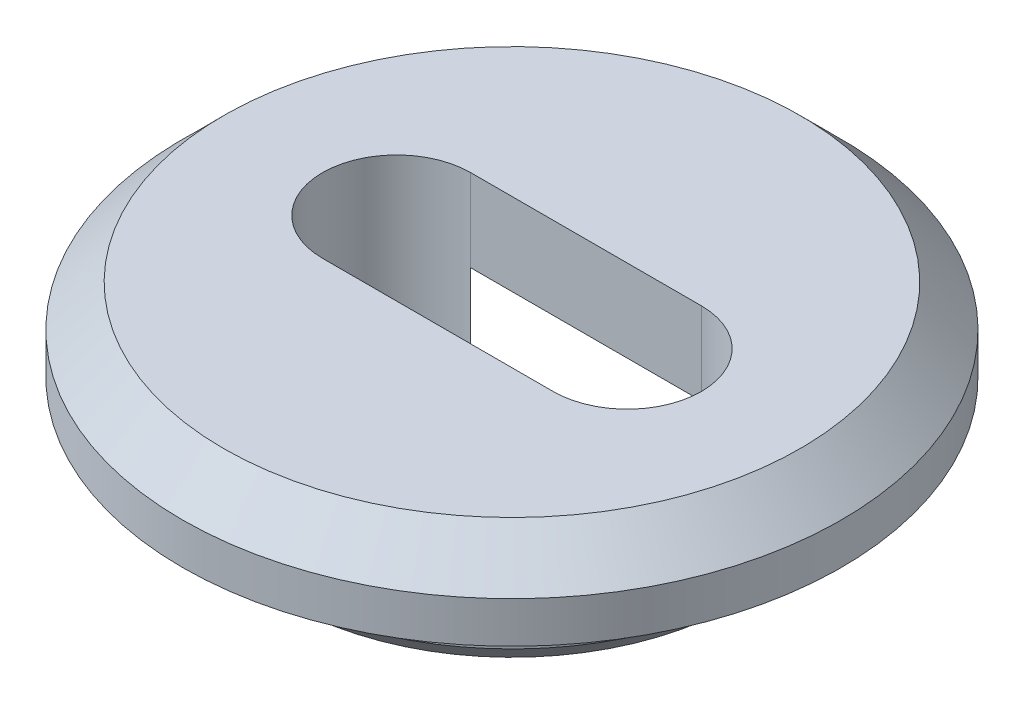
ISO-10303-21;
HEADER;
FILE_DESCRIPTION(('STEP AP214'),'2;1');
FILE_NAME('part.step','',(''),(''),'','','');
FILE_SCHEMA(('AUTOMOTIVE_DESIGN { 1 0 10303 214 1 1 1 1 }'));
ENDSEC;
DATA;
#1=APPLICATION_CONTEXT('core data for automotive mechanical design processes');
#2=APPLICATION_PROTOCOL_DEFINITION('international standard','automotive_design',2000,#1);
#3=PRODUCT_CONTEXT('',#1,'mechanical');
#4=PRODUCT('Part','Part','',(#3));
#5=PRODUCT_RELATED_PRODUCT_CATEGORY('part','',(#4));
#6=PRODUCT_DEFINITION_FORMATION('','',#4);
#7=PRODUCT_DEFINITION_CONTEXT('part definition',#1,'design');
#8=PRODUCT_DEFINITION('design','',#6,#7);
#9=PRODUCT_DEFINITION_SHAPE('','',#8);
#10=(LENGTH_UNIT() NAMED_UNIT(*) SI_UNIT(.MILLI.,.METRE.));
#11=(NAMED_UNIT(*) PLANE_ANGLE_UNIT() SI_UNIT($,.RADIAN.));
#12=(NAMED_UNIT(*) SI_UNIT($,.STERADIAN.) SOLID_ANGLE_UNIT());
#13=UNCERTAINTY_MEASURE_WITH_UNIT(LENGTH_MEASURE(1.E-05),#10,'distance_accuracy_value','');
#14=(GEOMETRIC_REPRESENTATION_CONTEXT(3) GLOBAL_UNCERTAINTY_ASSIGNED_CONTEXT((#13)) GLOBAL_UNIT_ASSIGNED_CONTEXT((#10,
#11,#12)) REPRESENTATION_CONTEXT('',''));
#15=CARTESIAN_POINT('',(0.,0.,0.));
#16=DIRECTION('',(0.,0.,1.));
#17=DIRECTION('',(1.,0.,0.));
#18=AXIS2_PLACEMENT_3D('',#15,#16,#17);
#19=CARTESIAN_POINT('',(0.,0.,0.));
#20=DIRECTION('',(0.,1.,0.));
#21=DIRECTION('',(0.,0.,1.));
#22=AXIS2_PLACEMENT_3D('',#19,#20,#21);
#23=CYLINDRICAL_SURFACE('',#22,6.1);
#24=DIRECTION('',(0.,1.,0.));
#25=VECTOR('',#24,1.);
#26=CARTESIAN_POINT('',(4.92442890089805,0.,-3.6));
#27=LINE('',#26,#25);
#28=CARTESIAN_POINT('',(4.92442890089805,-2.6,-3.6));
#29=VERTEX_POINT('',#28);
#30=CARTESIAN_POINT('',(4.92442890089805,-2.,-3.6));
#31=VERTEX_POINT('',#30);
#32=EDGE_CURVE('E128',#29,#31,#27,.T.);
#33=ORIENTED_EDGE('',*,*,#32,.F.);
#34=CARTESIAN_POINT('',(0.,-2.6,0.));
#35=DIRECTION('',(0.,-1.,0.));
#36=DIRECTION('',(0.,0.,-1.));
#37=AXIS2_PLACEMENT_3D('',#34,#35,#36);
#38=CIRCLE('',#37,6.1);
#39=CARTESIAN_POINT('',(-4.92442890089805,-2.6,-3.6));
#40=VERTEX_POINT('',#39);
#41=EDGE_CURVE('E116',#29,#40,#38,.F.);
#42=ORIENTED_EDGE('',*,*,#41,.T.);
#43=DIRECTION('',(0.,1.,0.));
#44=VECTOR('',#43,1.);
#45=CARTESIAN_POINT('',(-4.92442890089805,0.,-3.6));
#46=LINE('',#45,#44);
#47=CARTESIAN_POINT('',(-4.92442890089805,-2.,-3.6));
#48=VERTEX_POINT('',#47);
#49=EDGE_CURVE('E126',#48,#40,#46,.F.);
#50=ORIENTED_EDGE('',*,*,#49,.F.);
#51=CARTESIAN_POINT('',(0.,-2.,0.));
#52=DIRECTION('',(0.,1.,0.));
#53=DIRECTION('',(0.,0.,1.));
#54=AXIS2_PLACEMENT_3D('',#51,#52,#53);
#55=CIRCLE('',#54,6.1);
#56=EDGE_CURVE('E174',#31,#48,#55,.T.);
#57=ORIENTED_EDGE('',*,*,#56,.F.);
#58=EDGE_LOOP('',(#33,#42,#50,#57));
#59=FACE_BOUND('',#58,.T.);
#60=ADVANCED_FACE('F33',(#59),#23,.T.);
#61=CARTESIAN_POINT('',(-10.0418394398939,-2.,-3.6));
#62=DIRECTION('',(0.,0.,-1.));
#63=DIRECTION('',(-1.,0.,0.));
#64=AXIS2_PLACEMENT_3D('',#61,#62,#63);
#65=PLANE('',#64);
#66=DIRECTION('',(-1.,0.,0.));
#67=VECTOR('',#66,1.);
#68=CARTESIAN_POINT('',(-10.0418394398939,-2.6,-3.6));
#69=LINE('',#68,#67);
#70=EDGE_CURVE('E113',#29,#40,#69,.T.);
#71=ORIENTED_EDGE('',*,*,#70,.F.);
#72=ORIENTED_EDGE('',*,*,#32,.T.);
#73=DIRECTION('',(1.,0.,0.));
#74=VECTOR('',#73,1.);
#75=CARTESIAN_POINT('',(-10.0418394398939,-2.,-3.6));
#76=LINE('',#75,#74);
#77=EDGE_CURVE('E133',#48,#31,#76,.T.);
#78=ORIENTED_EDGE('',*,*,#77,.F.);
#79=ORIENTED_EDGE('',*,*,#49,.T.);
#80=EDGE_LOOP('',(#71,#72,#78,#79));
#81=FACE_BOUND('',#80,.T.);
#82=ADVANCED_FACE('F131',(#81),#65,.F.);
#83=DIRECTION('',(0.,1.,0.));
#84=VECTOR('',#83,1.);
#85=CARTESIAN_POINT('',(-5.82837884835912,0.,-1.8));
#86=LINE('',#85,#84);
#87=CARTESIAN_POINT('',(-5.82837884835912,-3.4,-1.8));
#88=VERTEX_POINT('',#87);
#89=CARTESIAN_POINT('',(-5.82837884835912,-2.,-1.8));
#90=VERTEX_POINT('',#89);
#91=EDGE_CURVE('E256',#88,#90,#86,.T.);
#92=ORIENTED_EDGE('',*,*,#91,.F.);
#93=CARTESIAN_POINT('',(0.,-3.4,0.));
#94=DIRECTION('',(0.,-1.,0.));
#95=DIRECTION('',(0.,0.,-1.));
#96=AXIS2_PLACEMENT_3D('',#93,#94,#95);
#97=CIRCLE('',#96,6.1);
#98=CARTESIAN_POINT('',(5.82837884835912,-3.4,-1.8));
#99=VERTEX_POINT('',#98);
#100=EDGE_CURVE('E182',#88,#99,#97,.F.);
#101=ORIENTED_EDGE('',*,*,#100,.T.);
#102=DIRECTION('',(0.,1.,0.));
#103=VECTOR('',#102,1.);
#104=CARTESIAN_POINT('',(5.82837884835912,0.,-1.8));
#105=LINE('',#104,#103);
#106=CARTESIAN_POINT('',(5.82837884835912,-2.,-1.8));
#107=VERTEX_POINT('',#106);
#108=EDGE_CURVE('E138',#107,#99,#105,.F.);
#109=ORIENTED_EDGE('',*,*,#108,.F.);
#110=EDGE_CURVE('E163',#90,#107,#55,.T.);
#111=ORIENTED_EDGE('',*,*,#110,.F.);
#112=EDGE_LOOP('',(#92,#101,#109,#111));
#113=FACE_BOUND('',#112,.T.);
#114=ADVANCED_FACE('F198',(#113),#23,.T.);
#115=CARTESIAN_POINT('',(-6.1,-4.,0.));
#116=DIRECTION('',(0.,-1.,0.));
#117=DIRECTION('',(0.,0.,-1.));
#118=AXIS2_PLACEMENT_3D('',#115,#116,#117);
#119=PLANE('',#118);
#120=DIRECTION('',(-1.,0.,0.));
#121=VECTOR('',#120,1.);
#122=CARTESIAN_POINT('',(-10.0418394398939,-4.,-1.8));
#123=LINE('',#122,#121);
#124=CARTESIAN_POINT('',(5.19711458407451,-4.,-1.8));
#125=VERTEX_POINT('',#124);
#126=CARTESIAN_POINT('',(2.8,-4.,-1.8));
#127=VERTEX_POINT('',#126);
#128=EDGE_CURVE('E266',#125,#127,#123,.T.);
#129=ORIENTED_EDGE('',*,*,#128,.F.);
#130=CARTESIAN_POINT('',(0.,-4.,0.));
#131=DIRECTION('',(0.,-1.,0.));
#132=DIRECTION('',(0.,0.,-1.));
#133=AXIS2_PLACEMENT_3D('',#130,#131,#132);
#134=CIRCLE('',#133,5.5);
#135=CARTESIAN_POINT('',(-5.19711458407451,-4.,-1.8));
#136=VERTEX_POINT('',#135);
#137=EDGE_CURVE('E46',#125,#136,#134,.T.);
#138=ORIENTED_EDGE('',*,*,#137,.T.);
#139=CARTESIAN_POINT('',(-2.8,-4.,-1.8));
#140=VERTEX_POINT('',#139);
#141=EDGE_CURVE('E129',#140,#136,#123,.T.);
#142=ORIENTED_EDGE('',*,*,#141,.F.);
#143=CARTESIAN_POINT('',(-2.8,-4.,0.));
#144=DIRECTION('',(0.,1.,0.));
#145=DIRECTION('',(0.,0.,1.));
#146=AXIS2_PLACEMENT_3D('',#143,#144,#145);
#147=CIRCLE('',#146,1.8);
#148=CARTESIAN_POINT('',(-2.8,-4.,1.8));
#149=VERTEX_POINT('',#148);
#150=EDGE_CURVE('E142',#140,#149,#147,.T.);
#151=ORIENTED_EDGE('',*,*,#150,.T.);
#152=DIRECTION('',(1.,0.,0.));
#153=VECTOR('',#152,1.);
#154=CARTESIAN_POINT('',(-2.8,-4.,1.8));
#155=LINE('',#154,#153);
#156=CARTESIAN_POINT('',(2.8,-4.,1.8));
#157=VERTEX_POINT('',#156);
#158=EDGE_CURVE('E145',#149,#157,#155,.T.);
#159=ORIENTED_EDGE('',*,*,#158,.T.);
#160=CARTESIAN_POINT('',(2.8,-4.,0.));
#161=DIRECTION('',(0.,1.,0.));
#162=DIRECTION('',(0.,0.,1.));
#163=AXIS2_PLACEMENT_3D('',#160,#161,#162);
#164=CIRCLE('',#163,1.8);
#165=EDGE_CURVE('E149',#157,#127,#164,.T.);
#166=ORIENTED_EDGE('',*,*,#165,.T.);
#167=EDGE_LOOP('',(#129,#138,#142,#151,#159,#166));
#168=FACE_BOUND('',#167,.T.);
#169=ADVANCED_FACE('F203',(#168),#119,.T.);
#170=CARTESIAN_POINT('',(-2.8,-4.,-1.8));
#171=DIRECTION('',(0.,0.,-1.));
#172=DIRECTION('',(-1.,0.,0.));
#173=AXIS2_PLACEMENT_3D('',#170,#171,#172);
#174=PLANE('',#173);
#175=DIRECTION('',(-1.,0.,0.));
#176=VECTOR('',#175,1.);
#177=CARTESIAN_POINT('',(-10.0418394398939,-2.,-1.8));
#178=LINE('',#177,#176);
#179=CARTESIAN_POINT('',(2.8,-2.,-1.8));
#180=VERTEX_POINT('',#179);
#181=CARTESIAN_POINT('',(-2.8,-2.,-1.8));
#182=VERTEX_POINT('',#181);
#183=EDGE_CURVE('E258',#180,#182,#178,.T.);
#184=ORIENTED_EDGE('',*,*,#183,.F.);
#185=DIRECTION('',(0.,1.,0.));
#186=VECTOR('',#185,1.);
#187=CARTESIAN_POINT('',(2.8,-4.,-1.8));
#188=LINE('',#187,#186);
#189=CARTESIAN_POINT('',(2.8,0.,-1.8));
#190=VERTEX_POINT('',#189);
#191=EDGE_CURVE('E167',#180,#190,#188,.T.);
#192=ORIENTED_EDGE('',*,*,#191,.T.);
#193=DIRECTION('',(-1.,0.,0.));
#194=VECTOR('',#193,1.);
#195=CARTESIAN_POINT('',(-2.8,0.,-1.8));
#196=LINE('',#195,#194);
#197=CARTESIAN_POINT('',(-2.8,0.,-1.8));
#198=VERTEX_POINT('',#197);
#199=EDGE_CURVE('E146',#190,#198,#196,.T.);
#200=ORIENTED_EDGE('',*,*,#199,.T.);
#201=DIRECTION('',(0.,1.,0.));
#202=VECTOR('',#201,1.);
#203=CARTESIAN_POINT('',(-2.8,-4.,-1.8));
#204=LINE('',#203,#202);
#205=EDGE_CURVE('E164',#182,#198,#204,.T.);
#206=ORIENTED_EDGE('',*,*,#205,.F.);
#207=EDGE_LOOP('',(#184,#192,#200,#206));
#208=FACE_BOUND('',#207,.T.);
#209=ADVANCED_FACE('F199',(#208),#174,.F.);
#210=CARTESIAN_POINT('',(0.,0.,0.));
#211=DIRECTION('',(0.,1.,0.));
#212=DIRECTION('',(0.,0.,1.));
#213=AXIS2_PLACEMENT_3D('',#210,#211,#212);
#214=PLANE('',#213);
#215=CARTESIAN_POINT('',(0.,0.,0.));
#216=DIRECTION('',(0.,1.,0.));
#217=DIRECTION('',(0.,0.,1.));
#218=AXIS2_PLACEMENT_3D('',#215,#216,#217);
#219=CIRCLE('',#218,7.);
#220=CARTESIAN_POINT('',(0.,0.,7.));
#221=VERTEX_POINT('',#220);
#222=EDGE_CURVE('E120',#221,#221,#219,.T.);
#223=ORIENTED_EDGE('',*,*,#222,.T.);
#224=EDGE_LOOP('',(#223));
#225=FACE_BOUND('',#224,.T.);
#226=CARTESIAN_POINT('',(-2.8,0.,0.));
#227=DIRECTION('',(0.,1.,0.));
#228=DIRECTION('',(0.,0.,1.));
#229=AXIS2_PLACEMENT_3D('',#226,#227,#228);
#230=CIRCLE('',#229,1.8);
#231=CARTESIAN_POINT('',(-2.8,0.,1.8));
#232=VERTEX_POINT('',#231);
#233=EDGE_CURVE('E134',#198,#232,#230,.T.);
#234=ORIENTED_EDGE('',*,*,#233,.F.);
#235=ORIENTED_EDGE('',*,*,#199,.F.);
#236=CARTESIAN_POINT('',(2.8,0.,0.));
#237=DIRECTION('',(0.,1.,0.));
#238=DIRECTION('',(0.,0.,1.));
#239=AXIS2_PLACEMENT_3D('',#236,#237,#238);
#240=CIRCLE('',#239,1.8);
#241=CARTESIAN_POINT('',(2.8,0.,1.8));
#242=VERTEX_POINT('',#241);
#243=EDGE_CURVE('E155',#242,#190,#240,.T.);
#244=ORIENTED_EDGE('',*,*,#243,.F.);
#245=DIRECTION('',(1.,0.,0.));
#246=VECTOR('',#245,1.);
#247=CARTESIAN_POINT('',(-2.8,0.,1.8));
#248=LINE('',#247,#246);
#249=EDGE_CURVE('E136',#232,#242,#248,.T.);
#250=ORIENTED_EDGE('',*,*,#249,.F.);
#251=EDGE_LOOP('',(#234,#235,#244,#250));
#252=FACE_BOUND('',#251,.T.);
#253=ADVANCED_FACE('F202',(#225,#252),#214,.T.);
#254=CARTESIAN_POINT('',(0.,0.,0.));
#255=DIRECTION('',(0.,1.,0.));
#256=DIRECTION('',(0.,0.,1.));
#257=AXIS2_PLACEMENT_3D('',#254,#255,#256);
#258=CYLINDRICAL_SURFACE('',#257,8.);
#259=CARTESIAN_POINT('',(0.,-1.00000000000001,0.));
#260=DIRECTION('',(0.,1.,0.));
#261=DIRECTION('',(0.,0.,1.));
#262=AXIS2_PLACEMENT_3D('',#259,#260,#261);
#263=CIRCLE('',#262,8.);
#264=CARTESIAN_POINT('',(0.,-1.00000000000001,8.));
#265=VERTEX_POINT('',#264);
#266=EDGE_CURVE('E179',#265,#265,#263,.F.);
#267=ORIENTED_EDGE('',*,*,#266,.T.);
#268=EDGE_LOOP('',(#267));
#269=FACE_BOUND('',#268,.T.);
#270=CARTESIAN_POINT('',(0.,-2.,0.));
#271=DIRECTION('',(0.,1.,0.));
#272=DIRECTION('',(0.,0.,1.));
#273=AXIS2_PLACEMENT_3D('',#270,#271,#272);
#274=CIRCLE('',#273,8.);
#275=CARTESIAN_POINT('',(0.,-2.,8.));
#276=VERTEX_POINT('',#275);
#277=EDGE_CURVE('E121',#276,#276,#274,.T.);
#278=ORIENTED_EDGE('',*,*,#277,.T.);
#279=EDGE_LOOP('',(#278));
#280=FACE_BOUND('',#279,.T.);
#281=ADVANCED_FACE('F224',(#269,#280),#258,.T.);
#282=CARTESIAN_POINT('',(-8.,-2.,0.));
#283=DIRECTION('',(0.,-1.,0.));
#284=DIRECTION('',(0.,0.,-1.));
#285=AXIS2_PLACEMENT_3D('',#282,#283,#284);
#286=PLANE('',#285);
#287=ORIENTED_EDGE('',*,*,#110,.T.);
#288=EDGE_CURVE('E260',#107,#180,#178,.T.);
#289=ORIENTED_EDGE('',*,*,#288,.T.);
#290=ORIENTED_EDGE('',*,*,#183,.T.);
#291=EDGE_CURVE('E253',#182,#90,#178,.T.);
#292=ORIENTED_EDGE('',*,*,#291,.T.);
#293=EDGE_LOOP('',(#287,#289,#290,#292));
#294=FACE_BOUND('',#293,.T.);
#295=ORIENTED_EDGE('',*,*,#56,.T.);
#296=ORIENTED_EDGE('',*,*,#77,.T.);
#297=EDGE_LOOP('',(#295,#296));
#298=FACE_BOUND('',#297,.T.);
#299=ORIENTED_EDGE('',*,*,#277,.F.);
#300=EDGE_LOOP('',(#299));
#301=FACE_BOUND('',#300,.T.);
#302=ADVANCED_FACE('F216',(#294,#298,#301),#286,.T.);
#303=CARTESIAN_POINT('',(-2.8,-4.,0.));
#304=DIRECTION('',(0.,1.,0.));
#305=DIRECTION('',(0.,0.,1.));
#306=AXIS2_PLACEMENT_3D('',#303,#304,#305);
#307=CYLINDRICAL_SURFACE('',#306,1.8);
#308=ORIENTED_EDGE('',*,*,#233,.T.);
#309=DIRECTION('',(0.,1.,0.));
#310=VECTOR('',#309,1.);
#311=CARTESIAN_POINT('',(-2.8,-4.,1.8));
#312=LINE('',#311,#310);
#313=EDGE_CURVE('E151',#149,#232,#312,.T.);
#314=ORIENTED_EDGE('',*,*,#313,.F.);
#315=ORIENTED_EDGE('',*,*,#150,.F.);
#316=EDGE_CURVE('E160',#140,#182,#204,.T.);
#317=ORIENTED_EDGE('',*,*,#316,.T.);
#318=ORIENTED_EDGE('',*,*,#205,.T.);
#319=EDGE_LOOP('',(#308,#314,#315,#317,#318));
#320=FACE_BOUND('',#319,.T.);
#321=ADVANCED_FACE('F209',(#320),#307,.F.);
#322=CARTESIAN_POINT('',(2.8,-4.,0.));
#323=DIRECTION('',(0.,1.,0.));
#324=DIRECTION('',(0.,0.,1.));
#325=AXIS2_PLACEMENT_3D('',#322,#323,#324);
#326=CYLINDRICAL_SURFACE('',#325,1.8);
#327=ORIENTED_EDGE('',*,*,#243,.T.);
#328=ORIENTED_EDGE('',*,*,#191,.F.);
#329=EDGE_CURVE('E165',#127,#180,#188,.T.);
#330=ORIENTED_EDGE('',*,*,#329,.F.);
#331=ORIENTED_EDGE('',*,*,#165,.F.);
#332=DIRECTION('',(0.,1.,0.));
#333=VECTOR('',#332,1.);
#334=CARTESIAN_POINT('',(2.8,-4.,1.8));
#335=LINE('',#334,#333);
#336=EDGE_CURVE('E168',#157,#242,#335,.T.);
#337=ORIENTED_EDGE('',*,*,#336,.T.);
#338=EDGE_LOOP('',(#327,#328,#330,#331,#337));
#339=FACE_BOUND('',#338,.T.);
#340=ADVANCED_FACE('F205',(#339),#326,.F.);
#341=CARTESIAN_POINT('',(-2.8,-4.,1.8));
#342=DIRECTION('',(0.,0.,1.));
#343=DIRECTION('',(1.,0.,0.));
#344=AXIS2_PLACEMENT_3D('',#341,#342,#343);
#345=PLANE('',#344);
#346=ORIENTED_EDGE('',*,*,#249,.T.);
#347=ORIENTED_EDGE('',*,*,#336,.F.);
#348=ORIENTED_EDGE('',*,*,#158,.F.);
#349=ORIENTED_EDGE('',*,*,#313,.T.);
#350=EDGE_LOOP('',(#346,#347,#348,#349));
#351=FACE_BOUND('',#350,.T.);
#352=ADVANCED_FACE('F208',(#351),#345,.F.);
#353=CARTESIAN_POINT('',(-10.0418394398939,-2.,-1.8));
#354=DIRECTION('',(0.,0.,1.));
#355=DIRECTION('',(1.,0.,0.));
#356=AXIS2_PLACEMENT_3D('',#353,#354,#355);
#357=PLANE('',#356);
#358=ORIENTED_EDGE('',*,*,#108,.T.);
#359=CARTESIAN_POINT('',(5.82837884835912,-3.4,-1.8));
#360=CARTESIAN_POINT('',(5.72344433361047,-3.50029056695327,-1.8));
#361=CARTESIAN_POINT('',(5.61837172608224,-3.60043584551173,-1.8));
#362=CARTESIAN_POINT('',(5.40795030470853,-3.80043584556906,-1.8));
#363=CARTESIAN_POINT('',(5.30260149080856,-3.9002905670106,-1.8));
#364=CARTESIAN_POINT('',(5.19711458407451,-4.,-1.8));
#365=B_SPLINE_CURVE_WITH_KNOTS('',3,(#359,#360,#361,#362,#363,#364),.UNSPECIFIED.,.F.,.F.,(4,2,
4),(0.,0.435458341328996,0.870916768573991),.UNSPECIFIED.);
#366=EDGE_CURVE('E60',#99,#125,#365,.T.);
#367=ORIENTED_EDGE('',*,*,#366,.T.);
#368=ORIENTED_EDGE('',*,*,#128,.T.);
#369=ORIENTED_EDGE('',*,*,#329,.T.);
#370=ORIENTED_EDGE('',*,*,#288,.F.);
#371=EDGE_LOOP('',(#358,#367,#368,#369,#370));
#372=FACE_BOUND('',#371,.T.);
#373=ADVANCED_FACE('F193',(#372),#357,.F.);
#374=ORIENTED_EDGE('',*,*,#141,.T.);
#375=CARTESIAN_POINT('',(-5.19711458407451,-4.,-1.8));
#376=CARTESIAN_POINT('',(-5.30260149080856,-3.9002905670106,-1.8));
#377=CARTESIAN_POINT('',(-5.40795030470853,-3.80043584556906,-1.8));
#378=CARTESIAN_POINT('',(-5.61837172608224,-3.60043584551173,-1.8));
#379=CARTESIAN_POINT('',(-5.72344433361047,-3.50029056695327,-1.8));
#380=CARTESIAN_POINT('',(-5.82837884835912,-3.4,-1.8));
#381=B_SPLINE_CURVE_WITH_KNOTS('',3,(#375,#376,#377,#378,#379,#380),.UNSPECIFIED.,.F.,.F.,(4,2,
4),(0.,0.435458427244995,0.870916768573991),.UNSPECIFIED.);
#382=EDGE_CURVE('E11',#136,#88,#381,.T.);
#383=ORIENTED_EDGE('',*,*,#382,.T.);
#384=ORIENTED_EDGE('',*,*,#91,.T.);
#385=ORIENTED_EDGE('',*,*,#291,.F.);
#386=ORIENTED_EDGE('',*,*,#316,.F.);
#387=EDGE_LOOP('',(#374,#383,#384,#385,#386));
#388=FACE_BOUND('',#387,.T.);
#389=ADVANCED_FACE('F188',(#388),#357,.F.);
#390=CARTESIAN_POINT('',(0.,-2.6,0.));
#391=DIRECTION('',(0.,-1.,0.));
#392=DIRECTION('',(0.,0.,-1.));
#393=AXIS2_PLACEMENT_3D('',#390,#391,#392);
#394=PLANE('',#393);
#395=ORIENTED_EDGE('',*,*,#70,.T.);
#396=ORIENTED_EDGE('',*,*,#41,.F.);
#397=EDGE_LOOP('',(#395,#396));
#398=FACE_BOUND('',#397,.T.);
#399=ADVANCED_FACE('F115',(#398),#394,.T.);
#400=CARTESIAN_POINT('',(0.,0.,0.));
#401=DIRECTION('',(0.,-1.,0.));
#402=DIRECTION('',(0.,0.,-1.));
#403=AXIS2_PLACEMENT_3D('',#400,#401,#402);
#404=CONICAL_SURFACE('',#403,7.,0.785398163397447);
#405=ORIENTED_EDGE('',*,*,#266,.F.);
#406=EDGE_LOOP('',(#405));
#407=FACE_BOUND('',#406,.T.);
#408=ORIENTED_EDGE('',*,*,#222,.F.);
#409=EDGE_LOOP('',(#408));
#410=FACE_BOUND('',#409,.T.);
#411=ADVANCED_FACE('F231',(#407,#410),#404,.T.);
#412=CARTESIAN_POINT('',(0.,-3.4,0.));
#413=DIRECTION('',(0.,1.,0.));
#414=DIRECTION('',(0.,0.,1.));
#415=AXIS2_PLACEMENT_3D('',#412,#413,#414);
#416=CONICAL_SURFACE('',#415,6.1,0.785398163397447);
#417=ORIENTED_EDGE('',*,*,#382,.F.);
#418=ORIENTED_EDGE('',*,*,#137,.F.);
#419=ORIENTED_EDGE('',*,*,#366,.F.);
#420=ORIENTED_EDGE('',*,*,#100,.F.);
#421=EDGE_LOOP('',(#417,#418,#419,#420));
#422=FACE_BOUND('',#421,.T.);
#423=ADVANCED_FACE('F35',(#422),#416,.T.);
#424=CLOSED_SHELL('',(#60,#82,#114,#169,#209,#253,#281,#302,#321,#340,#352,#373,#389,#399,#411,#423));
#425=MANIFOLD_SOLID_BREP('B2',#424);
#426=ADVANCED_BREP_SHAPE_REPRESENTATION('',(#18,#425),#14);
#427=SHAPE_DEFINITION_REPRESENTATION(#9,#426);
ENDSEC;
END-ISO-10303-21;
